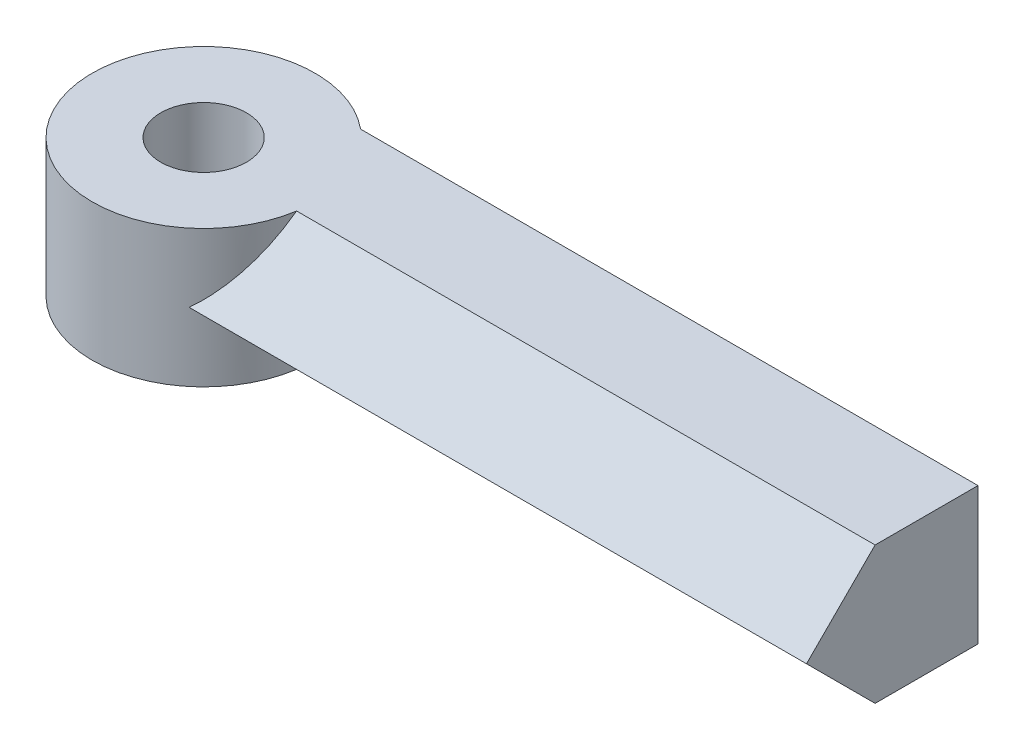
ISO-10303-21;
HEADER;
FILE_DESCRIPTION(('STEP AP214'),'2;1');
FILE_NAME('part.step','',(''),(''),'','','');
FILE_SCHEMA(('AUTOMOTIVE_DESIGN { 1 0 10303 214 1 1 1 1 }'));
ENDSEC;
DATA;
#1=APPLICATION_CONTEXT('core data for automotive mechanical design processes');
#2=APPLICATION_PROTOCOL_DEFINITION('international standard','automotive_design',2000,#1);
#3=PRODUCT_CONTEXT('',#1,'mechanical');
#4=PRODUCT('Part','Part','',(#3));
#5=PRODUCT_RELATED_PRODUCT_CATEGORY('part','',(#4));
#6=PRODUCT_DEFINITION_FORMATION('','',#4);
#7=PRODUCT_DEFINITION_CONTEXT('part definition',#1,'design');
#8=PRODUCT_DEFINITION('design','',#6,#7);
#9=PRODUCT_DEFINITION_SHAPE('','',#8);
#10=(LENGTH_UNIT() NAMED_UNIT(*) SI_UNIT(.MILLI.,.METRE.));
#11=(NAMED_UNIT(*) PLANE_ANGLE_UNIT() SI_UNIT($,.RADIAN.));
#12=(NAMED_UNIT(*) SI_UNIT($,.STERADIAN.) SOLID_ANGLE_UNIT());
#13=UNCERTAINTY_MEASURE_WITH_UNIT(LENGTH_MEASURE(1.E-05),#10,'distance_accuracy_value','');
#14=(GEOMETRIC_REPRESENTATION_CONTEXT(3) GLOBAL_UNCERTAINTY_ASSIGNED_CONTEXT((#13)) GLOBAL_UNIT_ASSIGNED_CONTEXT((#10,
#11,#12)) REPRESENTATION_CONTEXT('',''));
#15=CARTESIAN_POINT('',(0.,0.,0.));
#16=DIRECTION('',(0.,0.,1.));
#17=DIRECTION('',(1.,0.,0.));
#18=AXIS2_PLACEMENT_3D('',#15,#16,#17);
#19=CARTESIAN_POINT('',(0.,4.,0.));
#20=DIRECTION('',(0.,1.,0.));
#21=DIRECTION('',(0.,0.,1.));
#22=AXIS2_PLACEMENT_3D('',#19,#20,#21);
#23=PLANE('',#22);
#24=CARTESIAN_POINT('',(0.,4.,0.));
#25=DIRECTION('',(0.,1.,0.));
#26=DIRECTION('',(0.,0.,1.));
#27=AXIS2_PLACEMENT_3D('',#24,#25,#26);
#28=CIRCLE('',#27,3.25);
#29=CARTESIAN_POINT('',(2.07665596572952,4.,-2.5));
#30=VERTEX_POINT('',#29);
#31=CARTESIAN_POINT('',(3.21130814466628,4.,0.499999999999998));
#32=VERTEX_POINT('',#31);
#33=EDGE_CURVE('E71',#30,#32,#28,.T.);
#34=ORIENTED_EDGE('',*,*,#33,.T.);
#35=DIRECTION('',(1.,0.,0.));
#36=VECTOR('',#35,1.);
#37=CARTESIAN_POINT('',(0.,4.,0.499999999999998));
#38=LINE('',#37,#36);
#39=CARTESIAN_POINT('',(20.0766559657295,4.,0.499999999999998));
#40=VERTEX_POINT('',#39);
#41=EDGE_CURVE('E138',#32,#40,#38,.T.);
#42=ORIENTED_EDGE('',*,*,#41,.T.);
#43=DIRECTION('',(0.,0.,-1.));
#44=VECTOR('',#43,1.);
#45=CARTESIAN_POINT('',(20.0766559657295,4.,-2.5));
#46=LINE('',#45,#44);
#47=CARTESIAN_POINT('',(20.0766559657295,4.,-2.5));
#48=VERTEX_POINT('',#47);
#49=EDGE_CURVE('E108',#40,#48,#46,.T.);
#50=ORIENTED_EDGE('',*,*,#49,.T.);
#51=DIRECTION('',(-1.,0.,0.));
#52=VECTOR('',#51,1.);
#53=CARTESIAN_POINT('',(2.07665596572952,4.,-2.5));
#54=LINE('',#53,#52);
#55=EDGE_CURVE('E151',#48,#30,#54,.T.);
#56=ORIENTED_EDGE('',*,*,#55,.T.);
#57=EDGE_LOOP('',(#34,#42,#50,#56));
#58=FACE_BOUND('',#57,.T.);
#59=CARTESIAN_POINT('',(0.,4.,0.));
#60=DIRECTION('',(0.,1.,0.));
#61=DIRECTION('',(0.,0.,1.));
#62=AXIS2_PLACEMENT_3D('',#59,#60,#61);
#63=CIRCLE('',#62,1.25);
#64=CARTESIAN_POINT('',(0.,4.,1.25));
#65=VERTEX_POINT('',#64);
#66=EDGE_CURVE('E120',#65,#65,#63,.T.);
#67=ORIENTED_EDGE('',*,*,#66,.F.);
#68=EDGE_LOOP('',(#67));
#69=FACE_BOUND('',#68,.T.);
#70=ADVANCED_FACE('F47',(#58,#69),#23,.T.);
#71=CARTESIAN_POINT('',(0.,0.,0.));
#72=DIRECTION('',(0.,1.,0.));
#73=DIRECTION('',(0.,0.,1.));
#74=AXIS2_PLACEMENT_3D('',#71,#72,#73);
#75=PLANE('',#74);
#76=DIRECTION('',(0.,0.,-1.));
#77=VECTOR('',#76,1.);
#78=CARTESIAN_POINT('',(20.0766559657295,0.,-2.5));
#79=LINE('',#78,#77);
#80=CARTESIAN_POINT('',(20.0766559657295,0.,0.499999999999995));
#81=VERTEX_POINT('',#80);
#82=CARTESIAN_POINT('',(20.0766559657295,0.,-2.5));
#83=VERTEX_POINT('',#82);
#84=EDGE_CURVE('E107',#81,#83,#79,.T.);
#85=ORIENTED_EDGE('',*,*,#84,.F.);
#86=DIRECTION('',(-1.,0.,0.));
#87=VECTOR('',#86,1.);
#88=CARTESIAN_POINT('',(2.07665596572952,0.,0.499999999999995));
#89=LINE('',#88,#87);
#90=CARTESIAN_POINT('',(3.21130814466628,0.,0.499999999999995));
#91=VERTEX_POINT('',#90);
#92=EDGE_CURVE('E118',#81,#91,#89,.T.);
#93=ORIENTED_EDGE('',*,*,#92,.T.);
#94=CARTESIAN_POINT('',(0.,0.,0.));
#95=DIRECTION('',(0.,1.,0.));
#96=DIRECTION('',(0.,0.,1.));
#97=AXIS2_PLACEMENT_3D('',#94,#95,#96);
#98=CIRCLE('',#97,3.25);
#99=CARTESIAN_POINT('',(2.07665596572952,0.,-2.5));
#100=VERTEX_POINT('',#99);
#101=EDGE_CURVE('E111',#100,#91,#98,.T.);
#102=ORIENTED_EDGE('',*,*,#101,.F.);
#103=DIRECTION('',(-1.,0.,0.));
#104=VECTOR('',#103,1.);
#105=CARTESIAN_POINT('',(2.07665596572952,0.,-2.5));
#106=LINE('',#105,#104);
#107=EDGE_CURVE('E96',#83,#100,#106,.T.);
#108=ORIENTED_EDGE('',*,*,#107,.F.);
#109=EDGE_LOOP('',(#85,#93,#102,#108));
#110=FACE_BOUND('',#109,.T.);
#111=CARTESIAN_POINT('',(0.,0.,0.));
#112=DIRECTION('',(0.,1.,0.));
#113=DIRECTION('',(0.,0.,1.));
#114=AXIS2_PLACEMENT_3D('',#111,#112,#113);
#115=CIRCLE('',#114,1.25);
#116=CARTESIAN_POINT('',(0.,0.,1.25));
#117=VERTEX_POINT('',#116);
#118=EDGE_CURVE('E127',#117,#117,#115,.T.);
#119=ORIENTED_EDGE('',*,*,#118,.T.);
#120=EDGE_LOOP('',(#119));
#121=FACE_BOUND('',#120,.T.);
#122=ADVANCED_FACE('F115',(#110,#121),#75,.F.);
#123=CARTESIAN_POINT('',(0.,4.,0.));
#124=DIRECTION('',(0.,-1.,0.));
#125=DIRECTION('',(0.,0.,-1.));
#126=AXIS2_PLACEMENT_3D('',#123,#124,#125);
#127=CYLINDRICAL_SURFACE('',#126,3.25);
#128=ORIENTED_EDGE('',*,*,#33,.F.);
#129=DIRECTION('',(0.,1.,0.));
#130=VECTOR('',#129,1.);
#131=CARTESIAN_POINT('',(2.07665596572952,0.,-2.5));
#132=LINE('',#131,#130);
#133=EDGE_CURVE('E100',#100,#30,#132,.T.);
#134=ORIENTED_EDGE('',*,*,#133,.F.);
#135=ORIENTED_EDGE('',*,*,#101,.T.);
#136=CARTESIAN_POINT('',(0.,-0.499999999999993,0.));
#137=DIRECTION('',(0.,-0.707106781186549,0.707106781186546));
#138=DIRECTION('',(0.,-0.707106781186546,-0.707106781186549));
#139=AXIS2_PLACEMENT_3D('',#136,#137,#138);
#140=ELLIPSE('',#139,4.59619407771255,3.25);
#141=CARTESIAN_POINT('',(2.07665596572952,1.99999999999999,2.5));
#142=VERTEX_POINT('',#141);
#143=EDGE_CURVE('E58',#91,#142,#140,.T.);
#144=ORIENTED_EDGE('',*,*,#143,.T.);
#145=CARTESIAN_POINT('',(0.,4.5,0.));
#146=DIRECTION('',(0.,-0.707106781186546,-0.707106781186549));
#147=DIRECTION('',(0.,-0.707106781186549,0.707106781186546));
#148=AXIS2_PLACEMENT_3D('',#145,#146,#147);
#149=ELLIPSE('',#148,4.59619407771257,3.25);
#150=EDGE_CURVE('E11',#142,#32,#149,.F.);
#151=ORIENTED_EDGE('',*,*,#150,.T.);
#152=EDGE_LOOP('',(#128,#134,#135,#144,#151));
#153=FACE_BOUND('',#152,.T.);
#154=ADVANCED_FACE('F110',(#153),#127,.T.);
#155=CARTESIAN_POINT('',(0.,4.,0.));
#156=DIRECTION('',(0.,-1.,0.));
#157=DIRECTION('',(0.,0.,-1.));
#158=AXIS2_PLACEMENT_3D('',#155,#156,#157);
#159=CYLINDRICAL_SURFACE('',#158,1.25);
#160=ORIENTED_EDGE('',*,*,#66,.T.);
#161=EDGE_LOOP('',(#160));
#162=FACE_BOUND('',#161,.T.);
#163=ORIENTED_EDGE('',*,*,#118,.F.);
#164=EDGE_LOOP('',(#163));
#165=FACE_BOUND('',#164,.T.);
#166=ADVANCED_FACE('F168',(#162,#165),#159,.F.);
#167=CARTESIAN_POINT('',(2.07665596572952,0.,-2.5));
#168=DIRECTION('',(0.,0.,-1.));
#169=DIRECTION('',(-1.,0.,0.));
#170=AXIS2_PLACEMENT_3D('',#167,#168,#169);
#171=PLANE('',#170);
#172=ORIENTED_EDGE('',*,*,#55,.F.);
#173=DIRECTION('',(0.,1.,0.));
#174=VECTOR('',#173,1.);
#175=CARTESIAN_POINT('',(20.0766559657295,0.,-2.5));
#176=LINE('',#175,#174);
#177=EDGE_CURVE('E102',#83,#48,#176,.T.);
#178=ORIENTED_EDGE('',*,*,#177,.F.);
#179=ORIENTED_EDGE('',*,*,#107,.T.);
#180=ORIENTED_EDGE('',*,*,#133,.T.);
#181=EDGE_LOOP('',(#172,#178,#179,#180));
#182=FACE_BOUND('',#181,.T.);
#183=ADVANCED_FACE('F99',(#182),#171,.T.);
#184=CARTESIAN_POINT('',(20.0766559657295,0.,-2.5));
#185=DIRECTION('',(1.,0.,0.));
#186=DIRECTION('',(0.,0.,-1.));
#187=AXIS2_PLACEMENT_3D('',#184,#185,#186);
#188=PLANE('',#187);
#189=DIRECTION('',(0.,0.707106781186549,-0.707106781186546));
#190=VECTOR('',#189,1.);
#191=CARTESIAN_POINT('',(20.0766559657295,3.49999999999999,1.));
#192=LINE('',#191,#190);
#193=CARTESIAN_POINT('',(20.0766559657295,1.99999999999999,2.5));
#194=VERTEX_POINT('',#193);
#195=EDGE_CURVE('E124',#40,#194,#192,.F.);
#196=ORIENTED_EDGE('',*,*,#195,.T.);
#197=DIRECTION('',(0.,-0.707106781186546,-0.707106781186549));
#198=VECTOR('',#197,1.);
#199=CARTESIAN_POINT('',(20.0766559657295,-1.5,-1.00000000000001));
#200=LINE('',#199,#198);
#201=EDGE_CURVE('E133',#194,#81,#200,.T.);
#202=ORIENTED_EDGE('',*,*,#201,.T.);
#203=ORIENTED_EDGE('',*,*,#84,.T.);
#204=ORIENTED_EDGE('',*,*,#177,.T.);
#205=ORIENTED_EDGE('',*,*,#49,.F.);
#206=EDGE_LOOP('',(#196,#202,#203,#204,#205));
#207=FACE_BOUND('',#206,.T.);
#208=ADVANCED_FACE('F148',(#207),#188,.T.);
#209=CARTESIAN_POINT('',(0.,4.,0.499999999999998));
#210=DIRECTION('',(0.,-0.707106781186546,-0.707106781186549));
#211=DIRECTION('',(1.,0.,0.));
#212=AXIS2_PLACEMENT_3D('',#209,#210,#211);
#213=PLANE('',#212);
#214=ORIENTED_EDGE('',*,*,#41,.F.);
#215=ORIENTED_EDGE('',*,*,#150,.F.);
#216=DIRECTION('',(-1.,0.,0.));
#217=VECTOR('',#216,1.);
#218=CARTESIAN_POINT('',(20.0766559657295,1.99999999999999,2.5));
#219=LINE('',#218,#217);
#220=EDGE_CURVE('E52',#194,#142,#219,.T.);
#221=ORIENTED_EDGE('',*,*,#220,.F.);
#222=ORIENTED_EDGE('',*,*,#195,.F.);
#223=EDGE_LOOP('',(#214,#215,#221,#222));
#224=FACE_BOUND('',#223,.T.);
#225=ADVANCED_FACE('F50',(#224),#213,.F.);
#226=CARTESIAN_POINT('',(20.0766559657295,1.99999999999999,2.5));
#227=DIRECTION('',(0.,-0.707106781186549,0.707106781186546));
#228=DIRECTION('',(-1.,0.,0.));
#229=AXIS2_PLACEMENT_3D('',#226,#227,#228);
#230=PLANE('',#229);
#231=ORIENTED_EDGE('',*,*,#143,.F.);
#232=ORIENTED_EDGE('',*,*,#92,.F.);
#233=ORIENTED_EDGE('',*,*,#201,.F.);
#234=ORIENTED_EDGE('',*,*,#220,.T.);
#235=EDGE_LOOP('',(#231,#232,#233,#234));
#236=FACE_BOUND('',#235,.T.);
#237=ADVANCED_FACE('F157',(#236),#230,.T.);
#238=CLOSED_SHELL('',(#70,#122,#154,#166,#183,#208,#225,#237));
#239=MANIFOLD_SOLID_BREP('B2',#238);
#240=ADVANCED_BREP_SHAPE_REPRESENTATION('',(#18,#239),#14);
#241=SHAPE_DEFINITION_REPRESENTATION(#9,#240);
ENDSEC;
END-ISO-10303-21;
